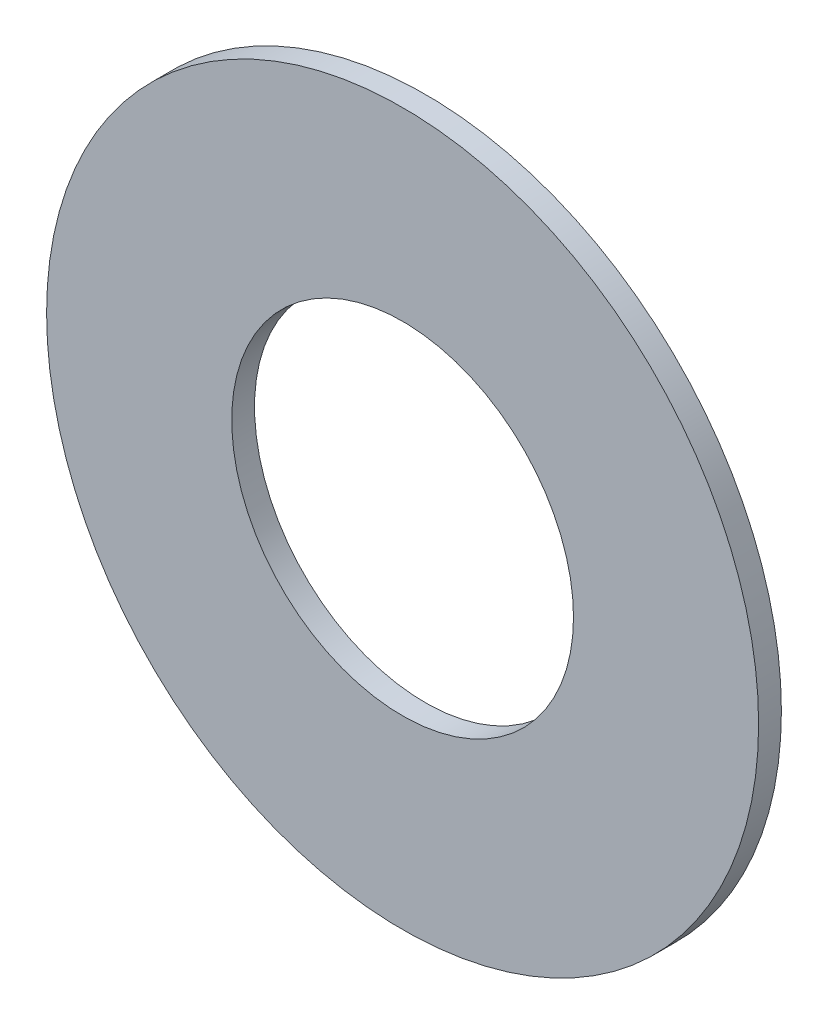
ISO-10303-21;
HEADER;
FILE_DESCRIPTION(('STEP AP214'),'2;1');
FILE_NAME('part.step','',(''),(''),'','','');
FILE_SCHEMA(('AUTOMOTIVE_DESIGN { 1 0 10303 214 1 1 1 1 }'));
ENDSEC;
DATA;
#1=APPLICATION_CONTEXT('core data for automotive mechanical design processes');
#2=APPLICATION_PROTOCOL_DEFINITION('international standard','automotive_design',2000,#1);
#3=PRODUCT_CONTEXT('',#1,'mechanical');
#4=PRODUCT('Part','Part','',(#3));
#5=PRODUCT_RELATED_PRODUCT_CATEGORY('part','',(#4));
#6=PRODUCT_DEFINITION_FORMATION('','',#4);
#7=PRODUCT_DEFINITION_CONTEXT('part definition',#1,'design');
#8=PRODUCT_DEFINITION('design','',#6,#7);
#9=PRODUCT_DEFINITION_SHAPE('','',#8);
#10=(LENGTH_UNIT() NAMED_UNIT(*) SI_UNIT(.MILLI.,.METRE.));
#11=(NAMED_UNIT(*) PLANE_ANGLE_UNIT() SI_UNIT($,.RADIAN.));
#12=(NAMED_UNIT(*) SI_UNIT($,.STERADIAN.) SOLID_ANGLE_UNIT());
#13=UNCERTAINTY_MEASURE_WITH_UNIT(LENGTH_MEASURE(1.E-05),#10,'distance_accuracy_value','');
#14=(GEOMETRIC_REPRESENTATION_CONTEXT(3) GLOBAL_UNCERTAINTY_ASSIGNED_CONTEXT((#13)) GLOBAL_UNIT_ASSIGNED_CONTEXT((#10,
#11,#12)) REPRESENTATION_CONTEXT('',''));
#15=CARTESIAN_POINT('',(0.,0.,0.));
#16=DIRECTION('',(0.,0.,1.));
#17=DIRECTION('',(1.,0.,0.));
#18=AXIS2_PLACEMENT_3D('',#15,#16,#17);
#19=CARTESIAN_POINT('',(0.,0.,0.));
#20=DIRECTION('',(0.,0.,1.));
#21=DIRECTION('',(1.,0.,0.));
#22=AXIS2_PLACEMENT_3D('',#19,#20,#21);
#23=PLANE('',#22);
#24=CARTESIAN_POINT('',(0.,0.,0.));
#25=DIRECTION('',(0.,0.,1.));
#26=DIRECTION('',(1.,0.,0.));
#27=AXIS2_PLACEMENT_3D('',#24,#25,#26);
#28=CIRCLE('',#27,3.175);
#29=CARTESIAN_POINT('',(3.175,0.,0.));
#30=VERTEX_POINT('',#29);
#31=EDGE_CURVE('E27',#30,#30,#28,.F.);
#32=ORIENTED_EDGE('',*,*,#31,.F.);
#33=EDGE_LOOP('',(#32));
#34=FACE_BOUND('',#33,.T.);
#35=CARTESIAN_POINT('',(0.,0.,0.));
#36=DIRECTION('',(0.,0.,1.));
#37=DIRECTION('',(1.,0.,0.));
#38=AXIS2_PLACEMENT_3D('',#35,#36,#37);
#39=CIRCLE('',#38,1.524);
#40=CARTESIAN_POINT('',(1.524,0.,0.));
#41=VERTEX_POINT('',#40);
#42=EDGE_CURVE('E18',#41,#41,#39,.F.);
#43=ORIENTED_EDGE('',*,*,#42,.T.);
#44=EDGE_LOOP('',(#43));
#45=FACE_BOUND('',#44,.T.);
#46=ADVANCED_FACE('F14',(#34,#45),#23,.T.);
#47=CARTESIAN_POINT('',(0.,0.,-0.2032));
#48=DIRECTION('',(0.,0.,1.));
#49=DIRECTION('',(1.,0.,0.));
#50=AXIS2_PLACEMENT_3D('',#47,#48,#49);
#51=CYLINDRICAL_SURFACE('',#50,1.524);
#52=CARTESIAN_POINT('',(0.,0.,-0.2032));
#53=DIRECTION('',(0.,0.,1.));
#54=DIRECTION('',(1.,0.,0.));
#55=AXIS2_PLACEMENT_3D('',#52,#53,#54);
#56=CIRCLE('',#55,1.524);
#57=CARTESIAN_POINT('',(1.524,0.,-0.2032));
#58=VERTEX_POINT('',#57);
#59=EDGE_CURVE('E22',#58,#58,#56,.F.);
#60=ORIENTED_EDGE('',*,*,#59,.T.);
#61=EDGE_LOOP('',(#60));
#62=FACE_BOUND('',#61,.T.);
#63=ORIENTED_EDGE('',*,*,#42,.F.);
#64=EDGE_LOOP('',(#63));
#65=FACE_BOUND('',#64,.T.);
#66=ADVANCED_FACE('F36',(#62,#65),#51,.F.);
#67=CARTESIAN_POINT('',(0.,0.,-0.2032));
#68=DIRECTION('',(0.,0.,1.));
#69=DIRECTION('',(1.,0.,0.));
#70=AXIS2_PLACEMENT_3D('',#67,#68,#69);
#71=CYLINDRICAL_SURFACE('',#70,3.175);
#72=ORIENTED_EDGE('',*,*,#31,.T.);
#73=EDGE_LOOP('',(#72));
#74=FACE_BOUND('',#73,.T.);
#75=CARTESIAN_POINT('',(0.,0.,-0.2032));
#76=DIRECTION('',(0.,0.,1.));
#77=DIRECTION('',(1.,0.,0.));
#78=AXIS2_PLACEMENT_3D('',#75,#76,#77);
#79=CIRCLE('',#78,3.175);
#80=CARTESIAN_POINT('',(3.175,0.,-0.2032));
#81=VERTEX_POINT('',#80);
#82=EDGE_CURVE('E9',#81,#81,#79,.T.);
#83=ORIENTED_EDGE('',*,*,#82,.T.);
#84=EDGE_LOOP('',(#83));
#85=FACE_BOUND('',#84,.T.);
#86=ADVANCED_FACE('F38',(#74,#85),#71,.T.);
#87=CARTESIAN_POINT('',(0.,0.,-0.2032));
#88=DIRECTION('',(0.,0.,1.));
#89=DIRECTION('',(1.,0.,0.));
#90=AXIS2_PLACEMENT_3D('',#87,#88,#89);
#91=PLANE('',#90);
#92=ORIENTED_EDGE('',*,*,#82,.F.);
#93=EDGE_LOOP('',(#92));
#94=FACE_BOUND('',#93,.T.);
#95=ORIENTED_EDGE('',*,*,#59,.F.);
#96=EDGE_LOOP('',(#95));
#97=FACE_BOUND('',#96,.T.);
#98=ADVANCED_FACE('F16',(#94,#97),#91,.F.);
#99=CLOSED_SHELL('',(#46,#66,#86,#98));
#100=MANIFOLD_SOLID_BREP('B1',#99);
#101=ADVANCED_BREP_SHAPE_REPRESENTATION('',(#18,#100),#14);
#102=SHAPE_DEFINITION_REPRESENTATION(#9,#101);
ENDSEC;
END-ISO-10303-21;
